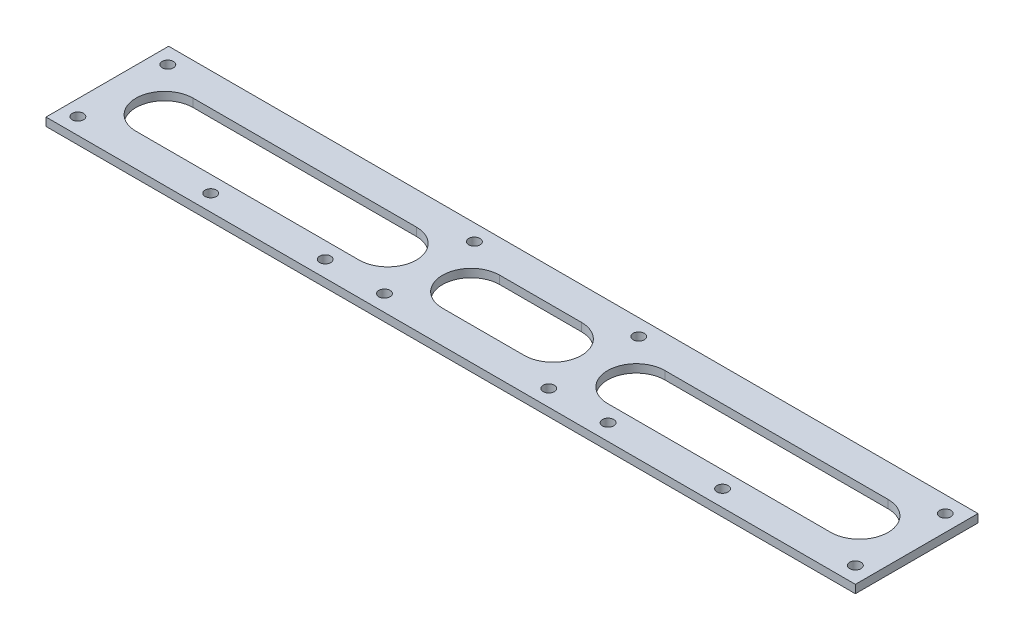
ISO-10303-21;
HEADER;
FILE_DESCRIPTION(('STEP AP214'),'2;1');
FILE_NAME('part.step','',(''),(''),'','','');
FILE_SCHEMA(('AUTOMOTIVE_DESIGN { 1 0 10303 214 1 1 1 1 }'));
ENDSEC;
DATA;
#1=APPLICATION_CONTEXT('core data for automotive mechanical design processes');
#2=APPLICATION_PROTOCOL_DEFINITION('international standard','automotive_design',2000,#1);
#3=PRODUCT_CONTEXT('',#1,'mechanical');
#4=PRODUCT('Part','Part','',(#3));
#5=PRODUCT_RELATED_PRODUCT_CATEGORY('part','',(#4));
#6=PRODUCT_DEFINITION_FORMATION('','',#4);
#7=PRODUCT_DEFINITION_CONTEXT('part definition',#1,'design');
#8=PRODUCT_DEFINITION('design','',#6,#7);
#9=PRODUCT_DEFINITION_SHAPE('','',#8);
#10=(LENGTH_UNIT() NAMED_UNIT(*) SI_UNIT(.MILLI.,.METRE.));
#11=(NAMED_UNIT(*) PLANE_ANGLE_UNIT() SI_UNIT($,.RADIAN.));
#12=(NAMED_UNIT(*) SI_UNIT($,.STERADIAN.) SOLID_ANGLE_UNIT());
#13=UNCERTAINTY_MEASURE_WITH_UNIT(LENGTH_MEASURE(1.E-05),#10,'distance_accuracy_value','');
#14=(GEOMETRIC_REPRESENTATION_CONTEXT(3) GLOBAL_UNCERTAINTY_ASSIGNED_CONTEXT((#13)) GLOBAL_UNIT_ASSIGNED_CONTEXT((#10,
#11,#12)) REPRESENTATION_CONTEXT('',''));
#15=CARTESIAN_POINT('',(0.,0.,0.));
#16=DIRECTION('',(0.,0.,1.));
#17=DIRECTION('',(1.,0.,0.));
#18=AXIS2_PLACEMENT_3D('',#15,#16,#17);
#19=CARTESIAN_POINT('',(-99.,2.,-15.));
#20=DIRECTION('',(1.,0.,0.));
#21=DIRECTION('',(0.,0.,-1.));
#22=AXIS2_PLACEMENT_3D('',#19,#20,#21);
#23=PLANE('',#22);
#24=DIRECTION('',(0.,0.,1.));
#25=VECTOR('',#24,1.);
#26=CARTESIAN_POINT('',(-99.,0.,-15.));
#27=LINE('',#26,#25);
#28=CARTESIAN_POINT('',(-99.,0.,-15.));
#29=VERTEX_POINT('',#28);
#30=CARTESIAN_POINT('',(-99.,0.,15.));
#31=VERTEX_POINT('',#30);
#32=EDGE_CURVE('E287',#29,#31,#27,.T.);
#33=ORIENTED_EDGE('',*,*,#32,.T.);
#34=DIRECTION('',(0.,-1.,0.));
#35=VECTOR('',#34,1.);
#36=CARTESIAN_POINT('',(-99.,2.,15.));
#37=LINE('',#36,#35);
#38=CARTESIAN_POINT('',(-99.,2.,15.));
#39=VERTEX_POINT('',#38);
#40=EDGE_CURVE('E11',#39,#31,#37,.T.);
#41=ORIENTED_EDGE('',*,*,#40,.F.);
#42=DIRECTION('',(0.,0.,1.));
#43=VECTOR('',#42,1.);
#44=CARTESIAN_POINT('',(-99.,2.,-15.));
#45=LINE('',#44,#43);
#46=CARTESIAN_POINT('',(-99.,2.,-15.));
#47=VERTEX_POINT('',#46);
#48=EDGE_CURVE('E288',#47,#39,#45,.T.);
#49=ORIENTED_EDGE('',*,*,#48,.F.);
#50=DIRECTION('',(0.,-1.,0.));
#51=VECTOR('',#50,1.);
#52=CARTESIAN_POINT('',(-99.,2.,-15.));
#53=LINE('',#52,#51);
#54=EDGE_CURVE('E298',#47,#29,#53,.T.);
#55=ORIENTED_EDGE('',*,*,#54,.T.);
#56=EDGE_LOOP('',(#33,#41,#49,#55));
#57=FACE_BOUND('',#56,.T.);
#58=ADVANCED_FACE('F36',(#57),#23,.F.);
#59=CARTESIAN_POINT('',(99.,2.,15.));
#60=DIRECTION('',(0.,0.,-1.));
#61=DIRECTION('',(-1.,0.,0.));
#62=AXIS2_PLACEMENT_3D('',#59,#60,#61);
#63=PLANE('',#62);
#64=DIRECTION('',(1.,0.,0.));
#65=VECTOR('',#64,1.);
#66=CARTESIAN_POINT('',(99.,0.,15.));
#67=LINE('',#66,#65);
#68=CARTESIAN_POINT('',(99.,0.,15.));
#69=VERTEX_POINT('',#68);
#70=EDGE_CURVE('E301',#31,#69,#67,.T.);
#71=ORIENTED_EDGE('',*,*,#70,.T.);
#72=DIRECTION('',(0.,-1.,0.));
#73=VECTOR('',#72,1.);
#74=CARTESIAN_POINT('',(99.,2.,15.));
#75=LINE('',#74,#73);
#76=CARTESIAN_POINT('',(99.,2.,15.));
#77=VERTEX_POINT('',#76);
#78=EDGE_CURVE('E44',#77,#69,#75,.T.);
#79=ORIENTED_EDGE('',*,*,#78,.F.);
#80=DIRECTION('',(1.,0.,0.));
#81=VECTOR('',#80,1.);
#82=CARTESIAN_POINT('',(99.,2.,15.));
#83=LINE('',#82,#81);
#84=EDGE_CURVE('E291',#39,#77,#83,.T.);
#85=ORIENTED_EDGE('',*,*,#84,.F.);
#86=ORIENTED_EDGE('',*,*,#40,.T.);
#87=EDGE_LOOP('',(#71,#79,#85,#86));
#88=FACE_BOUND('',#87,.T.);
#89=ADVANCED_FACE('F381',(#88),#63,.F.);
#90=CARTESIAN_POINT('',(99.,2.,-15.));
#91=DIRECTION('',(-1.,0.,0.));
#92=DIRECTION('',(0.,0.,1.));
#93=AXIS2_PLACEMENT_3D('',#90,#91,#92);
#94=PLANE('',#93);
#95=DIRECTION('',(0.,0.,-1.));
#96=VECTOR('',#95,1.);
#97=CARTESIAN_POINT('',(99.,0.,-15.));
#98=LINE('',#97,#96);
#99=CARTESIAN_POINT('',(99.,0.,-15.));
#100=VERTEX_POINT('',#99);
#101=EDGE_CURVE('E303',#69,#100,#98,.T.);
#102=ORIENTED_EDGE('',*,*,#101,.T.);
#103=DIRECTION('',(0.,-1.,0.));
#104=VECTOR('',#103,1.);
#105=CARTESIAN_POINT('',(99.,2.,-15.));
#106=LINE('',#105,#104);
#107=CARTESIAN_POINT('',(99.,2.,-15.));
#108=VERTEX_POINT('',#107);
#109=EDGE_CURVE('E308',#108,#100,#106,.T.);
#110=ORIENTED_EDGE('',*,*,#109,.F.);
#111=DIRECTION('',(0.,0.,-1.));
#112=VECTOR('',#111,1.);
#113=CARTESIAN_POINT('',(99.,2.,-15.));
#114=LINE('',#113,#112);
#115=EDGE_CURVE('E294',#77,#108,#114,.T.);
#116=ORIENTED_EDGE('',*,*,#115,.F.);
#117=ORIENTED_EDGE('',*,*,#78,.T.);
#118=EDGE_LOOP('',(#102,#110,#116,#117));
#119=FACE_BOUND('',#118,.T.);
#120=ADVANCED_FACE('F386',(#119),#94,.F.);
#121=CARTESIAN_POINT('',(99.,2.,-15.));
#122=DIRECTION('',(0.,0.,1.));
#123=DIRECTION('',(1.,0.,0.));
#124=AXIS2_PLACEMENT_3D('',#121,#122,#123);
#125=PLANE('',#124);
#126=DIRECTION('',(-1.,0.,0.));
#127=VECTOR('',#126,1.);
#128=CARTESIAN_POINT('',(99.,0.,-15.));
#129=LINE('',#128,#127);
#130=EDGE_CURVE('E292',#100,#29,#129,.T.);
#131=ORIENTED_EDGE('',*,*,#130,.T.);
#132=ORIENTED_EDGE('',*,*,#54,.F.);
#133=DIRECTION('',(-1.,0.,0.));
#134=VECTOR('',#133,1.);
#135=CARTESIAN_POINT('',(99.,2.,-15.));
#136=LINE('',#135,#134);
#137=EDGE_CURVE('E296',#108,#47,#136,.T.);
#138=ORIENTED_EDGE('',*,*,#137,.F.);
#139=ORIENTED_EDGE('',*,*,#109,.T.);
#140=EDGE_LOOP('',(#131,#132,#138,#139));
#141=FACE_BOUND('',#140,.T.);
#142=ADVANCED_FACE('F401',(#141),#125,.F.);
#143=CARTESIAN_POINT('',(0.,2.,0.));
#144=DIRECTION('',(0.,-1.,0.));
#145=DIRECTION('',(0.,0.,-1.));
#146=AXIS2_PLACEMENT_3D('',#143,#144,#145);
#147=PLANE('',#146);
#148=DIRECTION('',(1.,0.,0.));
#149=VECTOR('',#148,1.);
#150=CARTESIAN_POINT('',(-84.9999999965903,2.,7.00000000000003));
#151=LINE('',#150,#149);
#152=CARTESIAN_POINT('',(-84.9999999965903,2.,7.00000000000003));
#153=VERTEX_POINT('',#152);
#154=CARTESIAN_POINT('',(-30.4000000068193,2.,7.00000000000002));
#155=VERTEX_POINT('',#154);
#156=EDGE_CURVE('E177',#153,#155,#151,.T.);
#157=ORIENTED_EDGE('',*,*,#156,.F.);
#158=CARTESIAN_POINT('',(-84.9999999965903,2.,0.));
#159=DIRECTION('',(0.,1.,0.));
#160=DIRECTION('',(0.,0.,1.));
#161=AXIS2_PLACEMENT_3D('',#158,#159,#160);
#162=CIRCLE('',#161,7.00000000000002);
#163=CARTESIAN_POINT('',(-84.9999999965903,2.,-7.));
#164=VERTEX_POINT('',#163);
#165=EDGE_CURVE('E39',#164,#153,#162,.T.);
#166=ORIENTED_EDGE('',*,*,#165,.F.);
#167=DIRECTION('',(-1.,0.,0.));
#168=VECTOR('',#167,1.);
#169=CARTESIAN_POINT('',(-84.9999999965903,2.,-7.));
#170=LINE('',#169,#168);
#171=CARTESIAN_POINT('',(-30.4000000068193,2.,-7.00000000000001));
#172=VERTEX_POINT('',#171);
#173=EDGE_CURVE('E81',#172,#164,#170,.T.);
#174=ORIENTED_EDGE('',*,*,#173,.F.);
#175=CARTESIAN_POINT('',(-30.4000000068193,2.,0.));
#176=DIRECTION('',(0.,1.,0.));
#177=DIRECTION('',(0.,0.,1.));
#178=AXIS2_PLACEMENT_3D('',#175,#176,#177);
#179=CIRCLE('',#178,7.00000000000002);
#180=EDGE_CURVE('E179',#155,#172,#179,.T.);
#181=ORIENTED_EDGE('',*,*,#180,.F.);
#182=EDGE_LOOP('',(#157,#166,#174,#181));
#183=FACE_BOUND('',#182,.T.);
#184=DIRECTION('',(-1.,0.,0.));
#185=VECTOR('',#184,1.);
#186=CARTESIAN_POINT('',(84.9999999965904,2.,-7.));
#187=LINE('',#186,#185);
#188=CARTESIAN_POINT('',(84.9999999965904,2.,-7.));
#189=VERTEX_POINT('',#188);
#190=CARTESIAN_POINT('',(30.4000000068193,2.,-7.00000000000001));
#191=VERTEX_POINT('',#190);
#192=EDGE_CURVE('E176',#189,#191,#187,.T.);
#193=ORIENTED_EDGE('',*,*,#192,.F.);
#194=CARTESIAN_POINT('',(84.9999999965904,2.,0.));
#195=DIRECTION('',(0.,1.,0.));
#196=DIRECTION('',(0.,0.,1.));
#197=AXIS2_PLACEMENT_3D('',#194,#195,#196);
#198=CIRCLE('',#197,7.00000000000002);
#199=CARTESIAN_POINT('',(84.9999999965904,2.,7.00000000000003));
#200=VERTEX_POINT('',#199);
#201=EDGE_CURVE('E164',#200,#189,#198,.T.);
#202=ORIENTED_EDGE('',*,*,#201,.F.);
#203=DIRECTION('',(1.,0.,0.));
#204=VECTOR('',#203,1.);
#205=CARTESIAN_POINT('',(84.9999999965904,2.,7.00000000000003));
#206=LINE('',#205,#204);
#207=CARTESIAN_POINT('',(30.4000000068193,2.,7.00000000000002));
#208=VERTEX_POINT('',#207);
#209=EDGE_CURVE('E155',#208,#200,#206,.T.);
#210=ORIENTED_EDGE('',*,*,#209,.F.);
#211=CARTESIAN_POINT('',(30.4000000068193,2.,0.));
#212=DIRECTION('',(0.,1.,0.));
#213=DIRECTION('',(0.,0.,1.));
#214=AXIS2_PLACEMENT_3D('',#211,#212,#213);
#215=CIRCLE('',#214,7.00000000000002);
#216=EDGE_CURVE('E149',#191,#208,#215,.T.);
#217=ORIENTED_EDGE('',*,*,#216,.F.);
#218=EDGE_LOOP('',(#193,#202,#210,#217));
#219=FACE_BOUND('',#218,.T.);
#220=DIRECTION('',(1.,0.,0.));
#221=VECTOR('',#220,1.);
#222=CARTESIAN_POINT('',(-10.,2.,7.));
#223=LINE('',#222,#221);
#224=CARTESIAN_POINT('',(-10.,2.,7.));
#225=VERTEX_POINT('',#224);
#226=CARTESIAN_POINT('',(10.,2.,7.));
#227=VERTEX_POINT('',#226);
#228=EDGE_CURVE('E210',#225,#227,#223,.T.);
#229=ORIENTED_EDGE('',*,*,#228,.F.);
#230=CARTESIAN_POINT('',(-10.,2.,0.));
#231=DIRECTION('',(0.,1.,0.));
#232=DIRECTION('',(0.,0.,1.));
#233=AXIS2_PLACEMENT_3D('',#230,#231,#232);
#234=CIRCLE('',#233,7.);
#235=CARTESIAN_POINT('',(-10.,2.,-7.));
#236=VERTEX_POINT('',#235);
#237=EDGE_CURVE('E218',#236,#225,#234,.T.);
#238=ORIENTED_EDGE('',*,*,#237,.F.);
#239=DIRECTION('',(-1.,0.,0.));
#240=VECTOR('',#239,1.);
#241=CARTESIAN_POINT('',(-10.,2.,-7.));
#242=LINE('',#241,#240);
#243=CARTESIAN_POINT('',(10.,2.,-7.));
#244=VERTEX_POINT('',#243);
#245=EDGE_CURVE('E316',#244,#236,#242,.T.);
#246=ORIENTED_EDGE('',*,*,#245,.F.);
#247=CARTESIAN_POINT('',(10.,2.,0.));
#248=DIRECTION('',(0.,1.,0.));
#249=DIRECTION('',(0.,0.,1.));
#250=AXIS2_PLACEMENT_3D('',#247,#248,#249);
#251=CIRCLE('',#250,7.);
#252=EDGE_CURVE('E314',#227,#244,#251,.T.);
#253=ORIENTED_EDGE('',*,*,#252,.F.);
#254=EDGE_LOOP('',(#229,#238,#246,#253));
#255=FACE_BOUND('',#254,.T.);
#256=CARTESIAN_POINT('',(95.,2.,-10.9999998193783));
#257=DIRECTION('',(0.,1.,0.));
#258=DIRECTION('',(0.,0.,1.));
#259=AXIS2_PLACEMENT_3D('',#256,#257,#258);
#260=CIRCLE('',#259,1.37500000000002);
#261=CARTESIAN_POINT('',(95.,2.,-9.6249998193783));
#262=VERTEX_POINT('',#261);
#263=EDGE_CURVE('E214',#262,#262,#260,.T.);
#264=ORIENTED_EDGE('',*,*,#263,.F.);
#265=EDGE_LOOP('',(#264));
#266=FACE_BOUND('',#265,.T.);
#267=CARTESIAN_POINT('',(95.,2.,11.));
#268=DIRECTION('',(0.,1.,0.));
#269=DIRECTION('',(0.,0.,1.));
#270=AXIS2_PLACEMENT_3D('',#267,#268,#269);
#271=CIRCLE('',#270,1.37500000000002);
#272=CARTESIAN_POINT('',(95.,2.,12.375));
#273=VERTEX_POINT('',#272);
#274=EDGE_CURVE('E221',#273,#273,#271,.T.);
#275=ORIENTED_EDGE('',*,*,#274,.F.);
#276=EDGE_LOOP('',(#275));
#277=FACE_BOUND('',#276,.T.);
#278=CARTESIAN_POINT('',(20.0000000034097,2.,-10.9999998193783));
#279=DIRECTION('',(0.,1.,0.));
#280=DIRECTION('',(0.,0.,1.));
#281=AXIS2_PLACEMENT_3D('',#278,#279,#280);
#282=CIRCLE('',#281,1.37500000000002);
#283=CARTESIAN_POINT('',(20.0000000034097,2.,-9.62499981937829));
#284=VERTEX_POINT('',#283);
#285=EDGE_CURVE('E227',#284,#284,#282,.T.);
#286=ORIENTED_EDGE('',*,*,#285,.F.);
#287=EDGE_LOOP('',(#286));
#288=FACE_BOUND('',#287,.T.);
#289=CARTESIAN_POINT('',(20.0000000034097,2.,11.));
#290=DIRECTION('',(0.,1.,0.));
#291=DIRECTION('',(0.,0.,1.));
#292=AXIS2_PLACEMENT_3D('',#289,#290,#291);
#293=CIRCLE('',#292,1.37500000000002);
#294=CARTESIAN_POINT('',(20.0000000034097,2.,12.375));
#295=VERTEX_POINT('',#294);
#296=EDGE_CURVE('E233',#295,#295,#293,.T.);
#297=ORIENTED_EDGE('',*,*,#296,.F.);
#298=EDGE_LOOP('',(#297));
#299=FACE_BOUND('',#298,.T.);
#300=CARTESIAN_POINT('',(-95.2,2.,-10.9999998193783));
#301=DIRECTION('',(0.,1.,0.));
#302=DIRECTION('',(0.,0.,1.));
#303=AXIS2_PLACEMENT_3D('',#300,#301,#302);
#304=CIRCLE('',#303,1.37500000000002);
#305=CARTESIAN_POINT('',(-95.2,2.,-9.62499981937828));
#306=VERTEX_POINT('',#305);
#307=EDGE_CURVE('E239',#306,#306,#304,.T.);
#308=ORIENTED_EDGE('',*,*,#307,.F.);
#309=EDGE_LOOP('',(#308));
#310=FACE_BOUND('',#309,.T.);
#311=CARTESIAN_POINT('',(-95.2,2.,11.));
#312=DIRECTION('',(0.,1.,0.));
#313=DIRECTION('',(0.,0.,1.));
#314=AXIS2_PLACEMENT_3D('',#311,#312,#313);
#315=CIRCLE('',#314,1.37500000000002);
#316=CARTESIAN_POINT('',(-95.2,2.,12.375));
#317=VERTEX_POINT('',#316);
#318=EDGE_CURVE('E245',#317,#317,#315,.T.);
#319=ORIENTED_EDGE('',*,*,#318,.F.);
#320=EDGE_LOOP('',(#319));
#321=FACE_BOUND('',#320,.T.);
#322=CARTESIAN_POINT('',(-20.2000000034096,2.,-10.9999998193783));
#323=DIRECTION('',(0.,1.,0.));
#324=DIRECTION('',(0.,0.,1.));
#325=AXIS2_PLACEMENT_3D('',#322,#323,#324);
#326=CIRCLE('',#325,1.37500000000002);
#327=CARTESIAN_POINT('',(-20.2000000034096,2.,-9.62499981937829));
#328=VERTEX_POINT('',#327);
#329=EDGE_CURVE('E251',#328,#328,#326,.T.);
#330=ORIENTED_EDGE('',*,*,#329,.F.);
#331=EDGE_LOOP('',(#330));
#332=FACE_BOUND('',#331,.T.);
#333=CARTESIAN_POINT('',(-20.2000000034096,2.,11.));
#334=DIRECTION('',(0.,1.,0.));
#335=DIRECTION('',(0.,0.,1.));
#336=AXIS2_PLACEMENT_3D('',#333,#334,#335);
#337=CIRCLE('',#336,1.37500000000002);
#338=CARTESIAN_POINT('',(-20.2000000034096,2.,12.375));
#339=VERTEX_POINT('',#338);
#340=EDGE_CURVE('E257',#339,#339,#337,.T.);
#341=ORIENTED_EDGE('',*,*,#340,.F.);
#342=EDGE_LOOP('',(#341));
#343=FACE_BOUND('',#342,.T.);
#344=CARTESIAN_POINT('',(-34.7000034070527,2.,11.));
#345=DIRECTION('',(0.,1.,0.));
#346=DIRECTION('',(0.,0.,1.));
#347=AXIS2_PLACEMENT_3D('',#344,#345,#346);
#348=CIRCLE('',#347,1.37500000000002);
#349=CARTESIAN_POINT('',(-34.7000034070527,2.,12.375));
#350=VERTEX_POINT('',#349);
#351=EDGE_CURVE('E263',#350,#350,#348,.T.);
#352=ORIENTED_EDGE('',*,*,#351,.F.);
#353=EDGE_LOOP('',(#352));
#354=FACE_BOUND('',#353,.T.);
#355=CARTESIAN_POINT('',(-62.7000034070527,2.,11.));
#356=DIRECTION('',(0.,1.,0.));
#357=DIRECTION('',(0.,0.,1.));
#358=AXIS2_PLACEMENT_3D('',#355,#356,#357);
#359=CIRCLE('',#358,1.37500000000002);
#360=CARTESIAN_POINT('',(-62.7000034070527,2.,12.375));
#361=VERTEX_POINT('',#360);
#362=EDGE_CURVE('E269',#361,#361,#359,.T.);
#363=ORIENTED_EDGE('',*,*,#362,.F.);
#364=EDGE_LOOP('',(#363));
#365=FACE_BOUND('',#364,.T.);
#366=CARTESIAN_POINT('',(62.5000034070527,2.,11.));
#367=DIRECTION('',(0.,1.,0.));
#368=DIRECTION('',(0.,0.,1.));
#369=AXIS2_PLACEMENT_3D('',#366,#367,#368);
#370=CIRCLE('',#369,1.37500000000002);
#371=CARTESIAN_POINT('',(62.5000034070527,2.,12.375));
#372=VERTEX_POINT('',#371);
#373=EDGE_CURVE('E275',#372,#372,#370,.T.);
#374=ORIENTED_EDGE('',*,*,#373,.F.);
#375=EDGE_LOOP('',(#374));
#376=FACE_BOUND('',#375,.T.);
#377=CARTESIAN_POINT('',(34.5000034070527,2.,11.));
#378=DIRECTION('',(0.,1.,0.));
#379=DIRECTION('',(0.,0.,1.));
#380=AXIS2_PLACEMENT_3D('',#377,#378,#379);
#381=CIRCLE('',#380,1.37500000000002);
#382=CARTESIAN_POINT('',(34.5000034070527,2.,12.375));
#383=VERTEX_POINT('',#382);
#384=EDGE_CURVE('E281',#383,#383,#381,.T.);
#385=ORIENTED_EDGE('',*,*,#384,.F.);
#386=EDGE_LOOP('',(#385));
#387=FACE_BOUND('',#386,.T.);
#388=ORIENTED_EDGE('',*,*,#48,.T.);
#389=ORIENTED_EDGE('',*,*,#84,.T.);
#390=ORIENTED_EDGE('',*,*,#115,.T.);
#391=ORIENTED_EDGE('',*,*,#137,.T.);
#392=EDGE_LOOP('',(#388,#389,#390,#391));
#393=FACE_BOUND('',#392,.T.);
#394=ADVANCED_FACE('F174',(#183,#219,#255,#266,#277,#288,#299,#310,#321,#332,#343,#354,#365,
#376,#387,#393),#147,.F.);
#395=CARTESIAN_POINT('',(0.,0.,0.));
#396=DIRECTION('',(0.,-1.,0.));
#397=DIRECTION('',(0.,0.,-1.));
#398=AXIS2_PLACEMENT_3D('',#395,#396,#397);
#399=PLANE('',#398);
#400=CARTESIAN_POINT('',(-84.9999999965903,0.,0.));
#401=DIRECTION('',(0.,1.,0.));
#402=DIRECTION('',(0.,0.,1.));
#403=AXIS2_PLACEMENT_3D('',#400,#401,#402);
#404=CIRCLE('',#403,7.00000000000002);
#405=CARTESIAN_POINT('',(-84.9999999965903,0.,-7.));
#406=VERTEX_POINT('',#405);
#407=CARTESIAN_POINT('',(-84.9999999965903,0.,7.00000000000003));
#408=VERTEX_POINT('',#407);
#409=EDGE_CURVE('E172',#406,#408,#404,.T.);
#410=ORIENTED_EDGE('',*,*,#409,.T.);
#411=DIRECTION('',(1.,0.,0.));
#412=VECTOR('',#411,1.);
#413=CARTESIAN_POINT('',(-84.9999999965903,0.,7.00000000000003));
#414=LINE('',#413,#412);
#415=CARTESIAN_POINT('',(-30.4000000068193,0.,7.00000000000002));
#416=VERTEX_POINT('',#415);
#417=EDGE_CURVE('E359',#408,#416,#414,.T.);
#418=ORIENTED_EDGE('',*,*,#417,.T.);
#419=CARTESIAN_POINT('',(-30.4000000068193,0.,0.));
#420=DIRECTION('',(0.,1.,0.));
#421=DIRECTION('',(0.,0.,1.));
#422=AXIS2_PLACEMENT_3D('',#419,#420,#421);
#423=CIRCLE('',#422,7.00000000000002);
#424=CARTESIAN_POINT('',(-30.4000000068193,0.,-7.00000000000001));
#425=VERTEX_POINT('',#424);
#426=EDGE_CURVE('E363',#416,#425,#423,.T.);
#427=ORIENTED_EDGE('',*,*,#426,.T.);
#428=DIRECTION('',(-1.,0.,0.));
#429=VECTOR('',#428,1.);
#430=CARTESIAN_POINT('',(-84.9999999965903,0.,-7.));
#431=LINE('',#430,#429);
#432=EDGE_CURVE('E329',#425,#406,#431,.T.);
#433=ORIENTED_EDGE('',*,*,#432,.T.);
#434=EDGE_LOOP('',(#410,#418,#427,#433));
#435=FACE_BOUND('',#434,.T.);
#436=CARTESIAN_POINT('',(84.9999999965904,0.,0.));
#437=DIRECTION('',(0.,1.,0.));
#438=DIRECTION('',(0.,0.,-1.));
#439=AXIS2_PLACEMENT_3D('',#436,#437,#438);
#440=CIRCLE('',#439,7.00000000000002);
#441=CARTESIAN_POINT('',(84.9999999965904,0.,7.00000000000003));
#442=VERTEX_POINT('',#441);
#443=CARTESIAN_POINT('',(84.9999999965904,0.,-7.));
#444=VERTEX_POINT('',#443);
#445=EDGE_CURVE('E170',#442,#444,#440,.T.);
#446=ORIENTED_EDGE('',*,*,#445,.T.);
#447=DIRECTION('',(-1.,0.,0.));
#448=VECTOR('',#447,1.);
#449=CARTESIAN_POINT('',(84.9999999965904,0.,-7.));
#450=LINE('',#449,#448);
#451=CARTESIAN_POINT('',(30.4000000068193,0.,-7.00000000000001));
#452=VERTEX_POINT('',#451);
#453=EDGE_CURVE('E333',#444,#452,#450,.T.);
#454=ORIENTED_EDGE('',*,*,#453,.T.);
#455=CARTESIAN_POINT('',(30.4000000068193,0.,0.));
#456=DIRECTION('',(0.,1.,0.));
#457=DIRECTION('',(0.,0.,-1.));
#458=AXIS2_PLACEMENT_3D('',#455,#456,#457);
#459=CIRCLE('',#458,7.00000000000002);
#460=CARTESIAN_POINT('',(30.4000000068193,0.,7.00000000000002));
#461=VERTEX_POINT('',#460);
#462=EDGE_CURVE('E336',#452,#461,#459,.T.);
#463=ORIENTED_EDGE('',*,*,#462,.T.);
#464=DIRECTION('',(1.,0.,0.));
#465=VECTOR('',#464,1.);
#466=CARTESIAN_POINT('',(84.9999999965904,0.,7.00000000000003));
#467=LINE('',#466,#465);
#468=EDGE_CURVE('E339',#461,#442,#467,.T.);
#469=ORIENTED_EDGE('',*,*,#468,.T.);
#470=EDGE_LOOP('',(#446,#454,#463,#469));
#471=FACE_BOUND('',#470,.T.);
#472=CARTESIAN_POINT('',(-10.,0.,0.));
#473=DIRECTION('',(0.,1.,0.));
#474=DIRECTION('',(0.,0.,1.));
#475=AXIS2_PLACEMENT_3D('',#472,#473,#474);
#476=CIRCLE('',#475,7.);
#477=CARTESIAN_POINT('',(-10.,0.,-7.));
#478=VERTEX_POINT('',#477);
#479=CARTESIAN_POINT('',(-10.,0.,7.));
#480=VERTEX_POINT('',#479);
#481=EDGE_CURVE('E183',#478,#480,#476,.T.);
#482=ORIENTED_EDGE('',*,*,#481,.T.);
#483=DIRECTION('',(1.,0.,0.));
#484=VECTOR('',#483,1.);
#485=CARTESIAN_POINT('',(-10.,0.,7.));
#486=LINE('',#485,#484);
#487=CARTESIAN_POINT('',(10.,0.,7.));
#488=VERTEX_POINT('',#487);
#489=EDGE_CURVE('E188',#480,#488,#486,.T.);
#490=ORIENTED_EDGE('',*,*,#489,.T.);
#491=CARTESIAN_POINT('',(10.,0.,0.));
#492=DIRECTION('',(0.,1.,0.));
#493=DIRECTION('',(0.,0.,1.));
#494=AXIS2_PLACEMENT_3D('',#491,#492,#493);
#495=CIRCLE('',#494,7.);
#496=CARTESIAN_POINT('',(10.,0.,-7.));
#497=VERTEX_POINT('',#496);
#498=EDGE_CURVE('E193',#488,#497,#495,.T.);
#499=ORIENTED_EDGE('',*,*,#498,.T.);
#500=DIRECTION('',(-1.,0.,0.));
#501=VECTOR('',#500,1.);
#502=CARTESIAN_POINT('',(-10.,0.,-7.));
#503=LINE('',#502,#501);
#504=EDGE_CURVE('E201',#497,#478,#503,.T.);
#505=ORIENTED_EDGE('',*,*,#504,.T.);
#506=EDGE_LOOP('',(#482,#490,#499,#505));
#507=FACE_BOUND('',#506,.T.);
#508=CARTESIAN_POINT('',(95.,0.,-10.9999998193783));
#509=DIRECTION('',(0.,-1.,0.));
#510=DIRECTION('',(0.,0.,-1.));
#511=AXIS2_PLACEMENT_3D('',#508,#509,#510);
#512=CIRCLE('',#511,1.37500000000001);
#513=CARTESIAN_POINT('',(95.,0.,-12.3749998193783));
#514=VERTEX_POINT('',#513);
#515=EDGE_CURVE('E217',#514,#514,#512,.T.);
#516=ORIENTED_EDGE('',*,*,#515,.F.);
#517=EDGE_LOOP('',(#516));
#518=FACE_BOUND('',#517,.T.);
#519=CARTESIAN_POINT('',(95.,0.,11.));
#520=DIRECTION('',(0.,-1.,0.));
#521=DIRECTION('',(0.,0.,-1.));
#522=AXIS2_PLACEMENT_3D('',#519,#520,#521);
#523=CIRCLE('',#522,1.37500000000001);
#524=CARTESIAN_POINT('',(95.,0.,9.62499999999997));
#525=VERTEX_POINT('',#524);
#526=EDGE_CURVE('E224',#525,#525,#523,.T.);
#527=ORIENTED_EDGE('',*,*,#526,.F.);
#528=EDGE_LOOP('',(#527));
#529=FACE_BOUND('',#528,.T.);
#530=CARTESIAN_POINT('',(20.0000000034097,0.,-10.9999998193783));
#531=DIRECTION('',(0.,-1.,0.));
#532=DIRECTION('',(0.,0.,-1.));
#533=AXIS2_PLACEMENT_3D('',#530,#531,#532);
#534=CIRCLE('',#533,1.37500000000001);
#535=CARTESIAN_POINT('',(20.0000000034097,0.,-12.3749998193783));
#536=VERTEX_POINT('',#535);
#537=EDGE_CURVE('E230',#536,#536,#534,.T.);
#538=ORIENTED_EDGE('',*,*,#537,.F.);
#539=EDGE_LOOP('',(#538));
#540=FACE_BOUND('',#539,.T.);
#541=CARTESIAN_POINT('',(20.0000000034097,0.,11.));
#542=DIRECTION('',(0.,-1.,0.));
#543=DIRECTION('',(0.,0.,-1.));
#544=AXIS2_PLACEMENT_3D('',#541,#542,#543);
#545=CIRCLE('',#544,1.37500000000001);
#546=CARTESIAN_POINT('',(20.0000000034097,0.,9.62499999999998));
#547=VERTEX_POINT('',#546);
#548=EDGE_CURVE('E236',#547,#547,#545,.T.);
#549=ORIENTED_EDGE('',*,*,#548,.F.);
#550=EDGE_LOOP('',(#549));
#551=FACE_BOUND('',#550,.T.);
#552=CARTESIAN_POINT('',(-95.2,0.,-10.9999998193783));
#553=DIRECTION('',(0.,-1.,0.));
#554=DIRECTION('',(0.,0.,-1.));
#555=AXIS2_PLACEMENT_3D('',#552,#553,#554);
#556=CIRCLE('',#555,1.37500000000001);
#557=CARTESIAN_POINT('',(-95.2,0.,-12.3749998193783));
#558=VERTEX_POINT('',#557);
#559=EDGE_CURVE('E242',#558,#558,#556,.T.);
#560=ORIENTED_EDGE('',*,*,#559,.F.);
#561=EDGE_LOOP('',(#560));
#562=FACE_BOUND('',#561,.T.);
#563=CARTESIAN_POINT('',(-95.2,0.,11.));
#564=DIRECTION('',(0.,-1.,0.));
#565=DIRECTION('',(0.,0.,-1.));
#566=AXIS2_PLACEMENT_3D('',#563,#564,#565);
#567=CIRCLE('',#566,1.37500000000001);
#568=CARTESIAN_POINT('',(-95.2,0.,9.62499999999999));
#569=VERTEX_POINT('',#568);
#570=EDGE_CURVE('E248',#569,#569,#567,.T.);
#571=ORIENTED_EDGE('',*,*,#570,.F.);
#572=EDGE_LOOP('',(#571));
#573=FACE_BOUND('',#572,.T.);
#574=CARTESIAN_POINT('',(-20.2000000034096,0.,-10.9999998193783));
#575=DIRECTION('',(0.,-1.,0.));
#576=DIRECTION('',(0.,0.,-1.));
#577=AXIS2_PLACEMENT_3D('',#574,#575,#576);
#578=CIRCLE('',#577,1.37500000000001);
#579=CARTESIAN_POINT('',(-20.2000000034096,0.,-12.3749998193783));
#580=VERTEX_POINT('',#579);
#581=EDGE_CURVE('E254',#580,#580,#578,.T.);
#582=ORIENTED_EDGE('',*,*,#581,.F.);
#583=EDGE_LOOP('',(#582));
#584=FACE_BOUND('',#583,.T.);
#585=CARTESIAN_POINT('',(-20.2000000034096,0.,11.));
#586=DIRECTION('',(0.,-1.,0.));
#587=DIRECTION('',(0.,0.,-1.));
#588=AXIS2_PLACEMENT_3D('',#585,#586,#587);
#589=CIRCLE('',#588,1.37500000000001);
#590=CARTESIAN_POINT('',(-20.2000000034096,0.,9.62499999999998));
#591=VERTEX_POINT('',#590);
#592=EDGE_CURVE('E260',#591,#591,#589,.T.);
#593=ORIENTED_EDGE('',*,*,#592,.F.);
#594=EDGE_LOOP('',(#593));
#595=FACE_BOUND('',#594,.T.);
#596=CARTESIAN_POINT('',(-34.7000034070527,0.,11.));
#597=DIRECTION('',(0.,-1.,0.));
#598=DIRECTION('',(0.,0.,-1.));
#599=AXIS2_PLACEMENT_3D('',#596,#597,#598);
#600=CIRCLE('',#599,1.37500000000001);
#601=CARTESIAN_POINT('',(-34.7000034070527,0.,9.62499999999998));
#602=VERTEX_POINT('',#601);
#603=EDGE_CURVE('E266',#602,#602,#600,.T.);
#604=ORIENTED_EDGE('',*,*,#603,.F.);
#605=EDGE_LOOP('',(#604));
#606=FACE_BOUND('',#605,.T.);
#607=CARTESIAN_POINT('',(-62.7000034070527,0.,11.));
#608=DIRECTION('',(0.,-1.,0.));
#609=DIRECTION('',(0.,0.,-1.));
#610=AXIS2_PLACEMENT_3D('',#607,#608,#609);
#611=CIRCLE('',#610,1.37500000000001);
#612=CARTESIAN_POINT('',(-62.7000034070527,0.,9.62499999999999));
#613=VERTEX_POINT('',#612);
#614=EDGE_CURVE('E272',#613,#613,#611,.T.);
#615=ORIENTED_EDGE('',*,*,#614,.F.);
#616=EDGE_LOOP('',(#615));
#617=FACE_BOUND('',#616,.T.);
#618=CARTESIAN_POINT('',(62.5000034070527,0.,11.));
#619=DIRECTION('',(0.,-1.,0.));
#620=DIRECTION('',(0.,0.,-1.));
#621=AXIS2_PLACEMENT_3D('',#618,#619,#620);
#622=CIRCLE('',#621,1.37500000000001);
#623=CARTESIAN_POINT('',(62.5000034070527,0.,9.62499999999998));
#624=VERTEX_POINT('',#623);
#625=EDGE_CURVE('E278',#624,#624,#622,.T.);
#626=ORIENTED_EDGE('',*,*,#625,.F.);
#627=EDGE_LOOP('',(#626));
#628=FACE_BOUND('',#627,.T.);
#629=CARTESIAN_POINT('',(34.5000034070527,0.,11.));
#630=DIRECTION('',(0.,-1.,0.));
#631=DIRECTION('',(0.,0.,-1.));
#632=AXIS2_PLACEMENT_3D('',#629,#630,#631);
#633=CIRCLE('',#632,1.37500000000001);
#634=CARTESIAN_POINT('',(34.5000034070527,0.,9.62499999999998));
#635=VERTEX_POINT('',#634);
#636=EDGE_CURVE('E284',#635,#635,#633,.T.);
#637=ORIENTED_EDGE('',*,*,#636,.F.);
#638=EDGE_LOOP('',(#637));
#639=FACE_BOUND('',#638,.T.);
#640=ORIENTED_EDGE('',*,*,#32,.F.);
#641=ORIENTED_EDGE('',*,*,#130,.F.);
#642=ORIENTED_EDGE('',*,*,#101,.F.);
#643=ORIENTED_EDGE('',*,*,#70,.F.);
#644=EDGE_LOOP('',(#640,#641,#642,#643));
#645=FACE_BOUND('',#644,.T.);
#646=ADVANCED_FACE('F345',(#435,#471,#507,#518,#529,#540,#551,#562,#573,#584,#595,#606,#617,
#628,#639,#645),#399,.T.);
#647=CARTESIAN_POINT('',(34.5000034070527,2.,11.));
#648=DIRECTION('',(0.,1.,0.));
#649=DIRECTION('',(0.,0.,1.));
#650=AXIS2_PLACEMENT_3D('',#647,#648,#649);
#651=CYLINDRICAL_SURFACE('',#650,1.37500000000001);
#652=ORIENTED_EDGE('',*,*,#636,.T.);
#653=EDGE_LOOP('',(#652));
#654=FACE_BOUND('',#653,.T.);
#655=ORIENTED_EDGE('',*,*,#384,.T.);
#656=EDGE_LOOP('',(#655));
#657=FACE_BOUND('',#656,.T.);
#658=ADVANCED_FACE('F412',(#654,#657),#651,.F.);
#659=CARTESIAN_POINT('',(62.5000034070527,2.,11.));
#660=DIRECTION('',(0.,1.,0.));
#661=DIRECTION('',(0.,0.,1.));
#662=AXIS2_PLACEMENT_3D('',#659,#660,#661);
#663=CYLINDRICAL_SURFACE('',#662,1.37500000000001);
#664=ORIENTED_EDGE('',*,*,#625,.T.);
#665=EDGE_LOOP('',(#664));
#666=FACE_BOUND('',#665,.T.);
#667=ORIENTED_EDGE('',*,*,#373,.T.);
#668=EDGE_LOOP('',(#667));
#669=FACE_BOUND('',#668,.T.);
#670=ADVANCED_FACE('F418',(#666,#669),#663,.F.);
#671=CARTESIAN_POINT('',(-62.7000034070527,2.,11.));
#672=DIRECTION('',(0.,1.,0.));
#673=DIRECTION('',(0.,0.,1.));
#674=AXIS2_PLACEMENT_3D('',#671,#672,#673);
#675=CYLINDRICAL_SURFACE('',#674,1.37500000000001);
#676=ORIENTED_EDGE('',*,*,#614,.T.);
#677=EDGE_LOOP('',(#676));
#678=FACE_BOUND('',#677,.T.);
#679=ORIENTED_EDGE('',*,*,#362,.T.);
#680=EDGE_LOOP('',(#679));
#681=FACE_BOUND('',#680,.T.);
#682=ADVANCED_FACE('F422',(#678,#681),#675,.F.);
#683=CARTESIAN_POINT('',(-34.7000034070527,2.,11.));
#684=DIRECTION('',(0.,1.,0.));
#685=DIRECTION('',(0.,0.,1.));
#686=AXIS2_PLACEMENT_3D('',#683,#684,#685);
#687=CYLINDRICAL_SURFACE('',#686,1.37500000000001);
#688=ORIENTED_EDGE('',*,*,#603,.T.);
#689=EDGE_LOOP('',(#688));
#690=FACE_BOUND('',#689,.T.);
#691=ORIENTED_EDGE('',*,*,#351,.T.);
#692=EDGE_LOOP('',(#691));
#693=FACE_BOUND('',#692,.T.);
#694=ADVANCED_FACE('F426',(#690,#693),#687,.F.);
#695=CARTESIAN_POINT('',(-20.2000000034096,2.,11.));
#696=DIRECTION('',(0.,1.,0.));
#697=DIRECTION('',(0.,0.,1.));
#698=AXIS2_PLACEMENT_3D('',#695,#696,#697);
#699=CYLINDRICAL_SURFACE('',#698,1.37500000000001);
#700=ORIENTED_EDGE('',*,*,#592,.T.);
#701=EDGE_LOOP('',(#700));
#702=FACE_BOUND('',#701,.T.);
#703=ORIENTED_EDGE('',*,*,#340,.T.);
#704=EDGE_LOOP('',(#703));
#705=FACE_BOUND('',#704,.T.);
#706=ADVANCED_FACE('F430',(#702,#705),#699,.F.);
#707=CARTESIAN_POINT('',(-20.2000000034096,2.,-10.9999998193783));
#708=DIRECTION('',(0.,1.,0.));
#709=DIRECTION('',(0.,0.,1.));
#710=AXIS2_PLACEMENT_3D('',#707,#708,#709);
#711=CYLINDRICAL_SURFACE('',#710,1.37500000000001);
#712=ORIENTED_EDGE('',*,*,#581,.T.);
#713=EDGE_LOOP('',(#712));
#714=FACE_BOUND('',#713,.T.);
#715=ORIENTED_EDGE('',*,*,#329,.T.);
#716=EDGE_LOOP('',(#715));
#717=FACE_BOUND('',#716,.T.);
#718=ADVANCED_FACE('F434',(#714,#717),#711,.F.);
#719=CARTESIAN_POINT('',(-95.2,2.,11.));
#720=DIRECTION('',(0.,1.,0.));
#721=DIRECTION('',(0.,0.,1.));
#722=AXIS2_PLACEMENT_3D('',#719,#720,#721);
#723=CYLINDRICAL_SURFACE('',#722,1.37500000000001);
#724=ORIENTED_EDGE('',*,*,#570,.T.);
#725=EDGE_LOOP('',(#724));
#726=FACE_BOUND('',#725,.T.);
#727=ORIENTED_EDGE('',*,*,#318,.T.);
#728=EDGE_LOOP('',(#727));
#729=FACE_BOUND('',#728,.T.);
#730=ADVANCED_FACE('F438',(#726,#729),#723,.F.);
#731=CARTESIAN_POINT('',(-95.2,2.,-10.9999998193783));
#732=DIRECTION('',(0.,1.,0.));
#733=DIRECTION('',(0.,0.,1.));
#734=AXIS2_PLACEMENT_3D('',#731,#732,#733);
#735=CYLINDRICAL_SURFACE('',#734,1.37500000000001);
#736=ORIENTED_EDGE('',*,*,#559,.T.);
#737=EDGE_LOOP('',(#736));
#738=FACE_BOUND('',#737,.T.);
#739=ORIENTED_EDGE('',*,*,#307,.T.);
#740=EDGE_LOOP('',(#739));
#741=FACE_BOUND('',#740,.T.);
#742=ADVANCED_FACE('F442',(#738,#741),#735,.F.);
#743=CARTESIAN_POINT('',(20.0000000034097,2.,11.));
#744=DIRECTION('',(0.,1.,0.));
#745=DIRECTION('',(0.,0.,1.));
#746=AXIS2_PLACEMENT_3D('',#743,#744,#745);
#747=CYLINDRICAL_SURFACE('',#746,1.37500000000001);
#748=ORIENTED_EDGE('',*,*,#548,.T.);
#749=EDGE_LOOP('',(#748));
#750=FACE_BOUND('',#749,.T.);
#751=ORIENTED_EDGE('',*,*,#296,.T.);
#752=EDGE_LOOP('',(#751));
#753=FACE_BOUND('',#752,.T.);
#754=ADVANCED_FACE('F446',(#750,#753),#747,.F.);
#755=CARTESIAN_POINT('',(20.0000000034097,2.,-10.9999998193783));
#756=DIRECTION('',(0.,1.,0.));
#757=DIRECTION('',(0.,0.,1.));
#758=AXIS2_PLACEMENT_3D('',#755,#756,#757);
#759=CYLINDRICAL_SURFACE('',#758,1.37500000000001);
#760=ORIENTED_EDGE('',*,*,#537,.T.);
#761=EDGE_LOOP('',(#760));
#762=FACE_BOUND('',#761,.T.);
#763=ORIENTED_EDGE('',*,*,#285,.T.);
#764=EDGE_LOOP('',(#763));
#765=FACE_BOUND('',#764,.T.);
#766=ADVANCED_FACE('F450',(#762,#765),#759,.F.);
#767=CARTESIAN_POINT('',(95.,2.,11.));
#768=DIRECTION('',(0.,1.,0.));
#769=DIRECTION('',(0.,0.,1.));
#770=AXIS2_PLACEMENT_3D('',#767,#768,#769);
#771=CYLINDRICAL_SURFACE('',#770,1.37500000000001);
#772=ORIENTED_EDGE('',*,*,#526,.T.);
#773=EDGE_LOOP('',(#772));
#774=FACE_BOUND('',#773,.T.);
#775=ORIENTED_EDGE('',*,*,#274,.T.);
#776=EDGE_LOOP('',(#775));
#777=FACE_BOUND('',#776,.T.);
#778=ADVANCED_FACE('F454',(#774,#777),#771,.F.);
#779=CARTESIAN_POINT('',(95.,2.,-10.9999998193783));
#780=DIRECTION('',(0.,1.,0.));
#781=DIRECTION('',(0.,0.,1.));
#782=AXIS2_PLACEMENT_3D('',#779,#780,#781);
#783=CYLINDRICAL_SURFACE('',#782,1.37500000000001);
#784=ORIENTED_EDGE('',*,*,#515,.T.);
#785=EDGE_LOOP('',(#784));
#786=FACE_BOUND('',#785,.T.);
#787=ORIENTED_EDGE('',*,*,#263,.T.);
#788=EDGE_LOOP('',(#787));
#789=FACE_BOUND('',#788,.T.);
#790=ADVANCED_FACE('F458',(#786,#789),#783,.F.);
#791=CARTESIAN_POINT('',(-10.,0.,0.));
#792=DIRECTION('',(0.,1.,0.));
#793=DIRECTION('',(0.,0.,1.));
#794=AXIS2_PLACEMENT_3D('',#791,#792,#793);
#795=CYLINDRICAL_SURFACE('',#794,7.);
#796=DIRECTION('',(0.,1.,0.));
#797=VECTOR('',#796,1.);
#798=CARTESIAN_POINT('',(-10.,0.,7.));
#799=LINE('',#798,#797);
#800=EDGE_CURVE('E90',#480,#225,#799,.T.);
#801=ORIENTED_EDGE('',*,*,#800,.F.);
#802=ORIENTED_EDGE('',*,*,#481,.F.);
#803=DIRECTION('',(0.,1.,0.));
#804=VECTOR('',#803,1.);
#805=CARTESIAN_POINT('',(-10.,0.,-7.));
#806=LINE('',#805,#804);
#807=EDGE_CURVE('E206',#478,#236,#806,.T.);
#808=ORIENTED_EDGE('',*,*,#807,.T.);
#809=ORIENTED_EDGE('',*,*,#237,.T.);
#810=EDGE_LOOP('',(#801,#802,#808,#809));
#811=FACE_BOUND('',#810,.T.);
#812=ADVANCED_FACE('F462',(#811),#795,.F.);
#813=CARTESIAN_POINT('',(-10.,0.,-7.));
#814=DIRECTION('',(0.,0.,-1.));
#815=DIRECTION('',(-1.,0.,0.));
#816=AXIS2_PLACEMENT_3D('',#813,#814,#815);
#817=PLANE('',#816);
#818=ORIENTED_EDGE('',*,*,#807,.F.);
#819=ORIENTED_EDGE('',*,*,#504,.F.);
#820=DIRECTION('',(0.,1.,0.));
#821=VECTOR('',#820,1.);
#822=CARTESIAN_POINT('',(10.,0.,-7.));
#823=LINE('',#822,#821);
#824=EDGE_CURVE('E203',#497,#244,#823,.T.);
#825=ORIENTED_EDGE('',*,*,#824,.T.);
#826=ORIENTED_EDGE('',*,*,#245,.T.);
#827=EDGE_LOOP('',(#818,#819,#825,#826));
#828=FACE_BOUND('',#827,.T.);
#829=ADVANCED_FACE('F466',(#828),#817,.F.);
#830=CARTESIAN_POINT('',(10.,0.,0.));
#831=DIRECTION('',(0.,1.,0.));
#832=DIRECTION('',(0.,0.,1.));
#833=AXIS2_PLACEMENT_3D('',#830,#831,#832);
#834=CYLINDRICAL_SURFACE('',#833,7.);
#835=ORIENTED_EDGE('',*,*,#824,.F.);
#836=ORIENTED_EDGE('',*,*,#498,.F.);
#837=DIRECTION('',(0.,1.,0.));
#838=VECTOR('',#837,1.);
#839=CARTESIAN_POINT('',(10.,0.,7.));
#840=LINE('',#839,#838);
#841=EDGE_CURVE('E207',#488,#227,#840,.T.);
#842=ORIENTED_EDGE('',*,*,#841,.T.);
#843=ORIENTED_EDGE('',*,*,#252,.T.);
#844=EDGE_LOOP('',(#835,#836,#842,#843));
#845=FACE_BOUND('',#844,.T.);
#846=ADVANCED_FACE('F470',(#845),#834,.F.);
#847=CARTESIAN_POINT('',(-10.,0.,7.));
#848=DIRECTION('',(0.,0.,1.));
#849=DIRECTION('',(1.,0.,0.));
#850=AXIS2_PLACEMENT_3D('',#847,#848,#849);
#851=PLANE('',#850);
#852=ORIENTED_EDGE('',*,*,#841,.F.);
#853=ORIENTED_EDGE('',*,*,#489,.F.);
#854=ORIENTED_EDGE('',*,*,#800,.T.);
#855=ORIENTED_EDGE('',*,*,#228,.T.);
#856=EDGE_LOOP('',(#852,#853,#854,#855));
#857=FACE_BOUND('',#856,.T.);
#858=ADVANCED_FACE('F467',(#857),#851,.F.);
#859=CARTESIAN_POINT('',(84.9999999965904,0.,0.));
#860=DIRECTION('',(0.,1.,0.));
#861=DIRECTION('',(0.,0.,1.));
#862=AXIS2_PLACEMENT_3D('',#859,#860,#861);
#863=CYLINDRICAL_SURFACE('',#862,7.00000000000002);
#864=DIRECTION('',(0.,1.,0.));
#865=VECTOR('',#864,1.);
#866=CARTESIAN_POINT('',(84.9999999965904,0.,-7.));
#867=LINE('',#866,#865);
#868=EDGE_CURVE('E61',#444,#189,#867,.T.);
#869=ORIENTED_EDGE('',*,*,#868,.F.);
#870=ORIENTED_EDGE('',*,*,#445,.F.);
#871=DIRECTION('',(0.,1.,0.));
#872=VECTOR('',#871,1.);
#873=CARTESIAN_POINT('',(84.9999999965904,0.,7.00000000000003));
#874=LINE('',#873,#872);
#875=EDGE_CURVE('E159',#442,#200,#874,.T.);
#876=ORIENTED_EDGE('',*,*,#875,.T.);
#877=ORIENTED_EDGE('',*,*,#201,.T.);
#878=EDGE_LOOP('',(#869,#870,#876,#877));
#879=FACE_BOUND('',#878,.T.);
#880=ADVANCED_FACE('F167',(#879),#863,.F.);
#881=CARTESIAN_POINT('',(84.9999999965904,0.,7.00000000000003));
#882=DIRECTION('',(0.,0.,1.));
#883=DIRECTION('',(1.,0.,0.));
#884=AXIS2_PLACEMENT_3D('',#881,#882,#883);
#885=PLANE('',#884);
#886=ORIENTED_EDGE('',*,*,#875,.F.);
#887=ORIENTED_EDGE('',*,*,#468,.F.);
#888=DIRECTION('',(0.,1.,0.));
#889=VECTOR('',#888,1.);
#890=CARTESIAN_POINT('',(30.4000000068193,0.,7.00000000000002));
#891=LINE('',#890,#889);
#892=EDGE_CURVE('E161',#461,#208,#891,.T.);
#893=ORIENTED_EDGE('',*,*,#892,.T.);
#894=ORIENTED_EDGE('',*,*,#209,.T.);
#895=EDGE_LOOP('',(#886,#887,#893,#894));
#896=FACE_BOUND('',#895,.T.);
#897=ADVANCED_FACE('F157',(#896),#885,.F.);
#898=CARTESIAN_POINT('',(30.4000000068193,0.,0.));
#899=DIRECTION('',(0.,1.,0.));
#900=DIRECTION('',(0.,0.,1.));
#901=AXIS2_PLACEMENT_3D('',#898,#899,#900);
#902=CYLINDRICAL_SURFACE('',#901,7.00000000000002);
#903=ORIENTED_EDGE('',*,*,#892,.F.);
#904=ORIENTED_EDGE('',*,*,#462,.F.);
#905=DIRECTION('',(0.,1.,0.));
#906=VECTOR('',#905,1.);
#907=CARTESIAN_POINT('',(30.4000000068193,0.,-7.00000000000001));
#908=LINE('',#907,#906);
#909=EDGE_CURVE('E196',#452,#191,#908,.T.);
#910=ORIENTED_EDGE('',*,*,#909,.T.);
#911=ORIENTED_EDGE('',*,*,#216,.T.);
#912=EDGE_LOOP('',(#903,#904,#910,#911));
#913=FACE_BOUND('',#912,.T.);
#914=ADVANCED_FACE('F341',(#913),#902,.F.);
#915=CARTESIAN_POINT('',(84.9999999965904,0.,-7.));
#916=DIRECTION('',(0.,0.,-1.));
#917=DIRECTION('',(-1.,0.,0.));
#918=AXIS2_PLACEMENT_3D('',#915,#916,#917);
#919=PLANE('',#918);
#920=ORIENTED_EDGE('',*,*,#909,.F.);
#921=ORIENTED_EDGE('',*,*,#453,.F.);
#922=ORIENTED_EDGE('',*,*,#868,.T.);
#923=ORIENTED_EDGE('',*,*,#192,.T.);
#924=EDGE_LOOP('',(#920,#921,#922,#923));
#925=FACE_BOUND('',#924,.T.);
#926=ADVANCED_FACE('F342',(#925),#919,.F.);
#927=CARTESIAN_POINT('',(-84.9999999965903,0.,0.));
#928=DIRECTION('',(0.,1.,0.));
#929=DIRECTION('',(0.,0.,1.));
#930=AXIS2_PLACEMENT_3D('',#927,#928,#929);
#931=CYLINDRICAL_SURFACE('',#930,7.00000000000002);
#932=DIRECTION('',(0.,1.,0.));
#933=VECTOR('',#932,1.);
#934=CARTESIAN_POINT('',(-84.9999999965903,0.,7.00000000000003));
#935=LINE('',#934,#933);
#936=EDGE_CURVE('E52',#408,#153,#935,.T.);
#937=ORIENTED_EDGE('',*,*,#936,.F.);
#938=ORIENTED_EDGE('',*,*,#409,.F.);
#939=DIRECTION('',(0.,1.,0.));
#940=VECTOR('',#939,1.);
#941=CARTESIAN_POINT('',(-84.9999999965903,0.,-7.));
#942=LINE('',#941,#940);
#943=EDGE_CURVE('E319',#406,#164,#942,.T.);
#944=ORIENTED_EDGE('',*,*,#943,.T.);
#945=ORIENTED_EDGE('',*,*,#165,.T.);
#946=EDGE_LOOP('',(#937,#938,#944,#945));
#947=FACE_BOUND('',#946,.T.);
#948=ADVANCED_FACE('F354',(#947),#931,.F.);
#949=CARTESIAN_POINT('',(-84.9999999965903,0.,-7.));
#950=DIRECTION('',(0.,0.,-1.));
#951=DIRECTION('',(-1.,0.,0.));
#952=AXIS2_PLACEMENT_3D('',#949,#950,#951);
#953=PLANE('',#952);
#954=ORIENTED_EDGE('',*,*,#943,.F.);
#955=ORIENTED_EDGE('',*,*,#432,.F.);
#956=DIRECTION('',(0.,1.,0.));
#957=VECTOR('',#956,1.);
#958=CARTESIAN_POINT('',(-30.4000000068193,0.,-7.00000000000001));
#959=LINE('',#958,#957);
#960=EDGE_CURVE('E321',#425,#172,#959,.T.);
#961=ORIENTED_EDGE('',*,*,#960,.T.);
#962=ORIENTED_EDGE('',*,*,#173,.T.);
#963=EDGE_LOOP('',(#954,#955,#961,#962));
#964=FACE_BOUND('',#963,.T.);
#965=ADVANCED_FACE('F371',(#964),#953,.F.);
#966=CARTESIAN_POINT('',(-30.4000000068193,0.,0.));
#967=DIRECTION('',(0.,1.,0.));
#968=DIRECTION('',(0.,0.,1.));
#969=AXIS2_PLACEMENT_3D('',#966,#967,#968);
#970=CYLINDRICAL_SURFACE('',#969,7.00000000000002);
#971=ORIENTED_EDGE('',*,*,#960,.F.);
#972=ORIENTED_EDGE('',*,*,#426,.F.);
#973=DIRECTION('',(0.,1.,0.));
#974=VECTOR('',#973,1.);
#975=CARTESIAN_POINT('',(-30.4000000068193,0.,7.00000000000002));
#976=LINE('',#975,#974);
#977=EDGE_CURVE('E324',#416,#155,#976,.T.);
#978=ORIENTED_EDGE('',*,*,#977,.T.);
#979=ORIENTED_EDGE('',*,*,#180,.T.);
#980=EDGE_LOOP('',(#971,#972,#978,#979));
#981=FACE_BOUND('',#980,.T.);
#982=ADVANCED_FACE('F369',(#981),#970,.F.);
#983=CARTESIAN_POINT('',(-84.9999999965903,0.,7.00000000000003));
#984=DIRECTION('',(0.,0.,1.));
#985=DIRECTION('',(1.,0.,0.));
#986=AXIS2_PLACEMENT_3D('',#983,#984,#985);
#987=PLANE('',#986);
#988=ORIENTED_EDGE('',*,*,#977,.F.);
#989=ORIENTED_EDGE('',*,*,#417,.F.);
#990=ORIENTED_EDGE('',*,*,#936,.T.);
#991=ORIENTED_EDGE('',*,*,#156,.T.);
#992=EDGE_LOOP('',(#988,#989,#990,#991));
#993=FACE_BOUND('',#992,.T.);
#994=ADVANCED_FACE('F360',(#993),#987,.F.);
#995=CLOSED_SHELL('',(#58,#89,#120,#142,#394,#646,#658,#670,#682,#694,#706,#718,#730,#742,#754,
#766,#778,#790,#812,#829,#846,#858,#880,#897,#914,#926,#948,#965,#982,#994));
#996=MANIFOLD_SOLID_BREP('B2',#995);
#997=ADVANCED_BREP_SHAPE_REPRESENTATION('',(#18,#996),#14);
#998=SHAPE_DEFINITION_REPRESENTATION(#9,#997);
ENDSEC;
END-ISO-10303-21;
